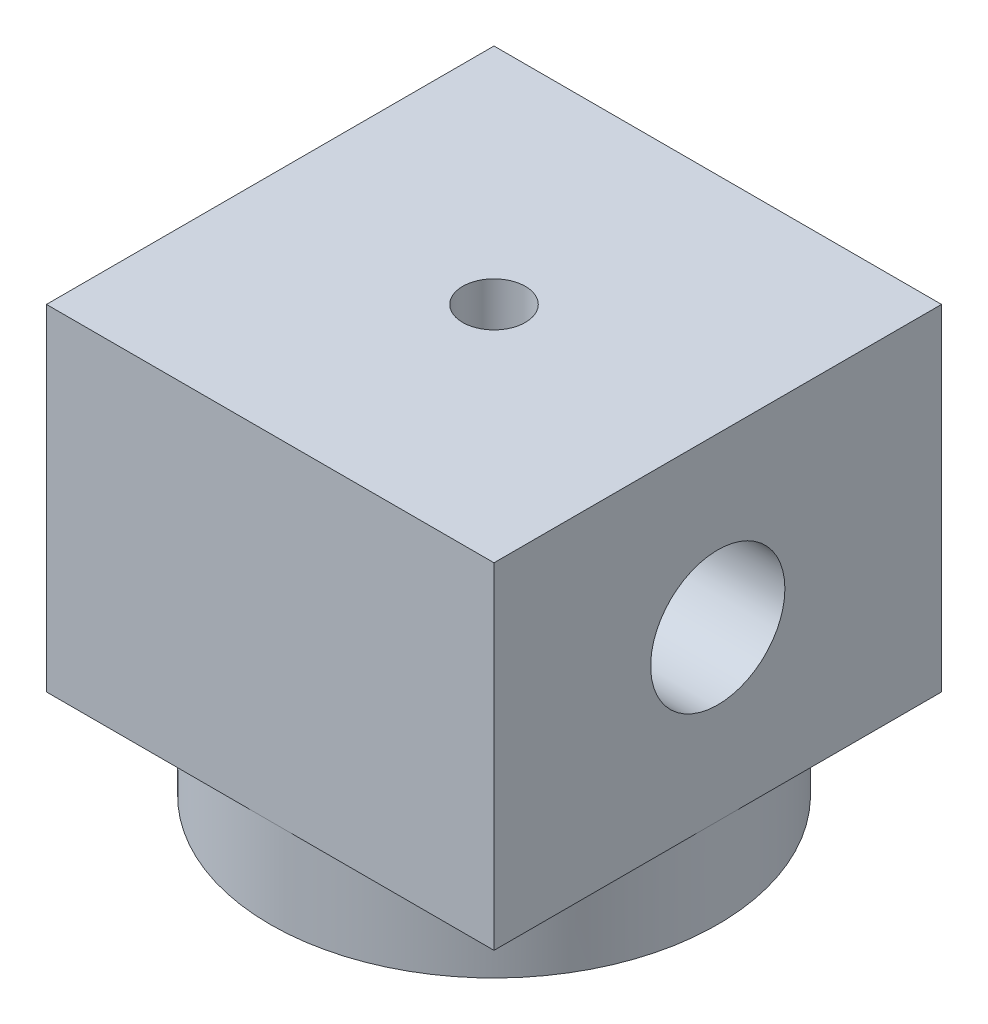
ISO-10303-21;
HEADER;
FILE_DESCRIPTION(('STEP AP214'),'2;1');
FILE_NAME('part.step','',(''),(''),'','','');
FILE_SCHEMA(('AUTOMOTIVE_DESIGN { 1 0 10303 214 1 1 1 1 }'));
ENDSEC;
DATA;
#1=APPLICATION_CONTEXT('core data for automotive mechanical design processes');
#2=APPLICATION_PROTOCOL_DEFINITION('international standard','automotive_design',2000,#1);
#3=PRODUCT_CONTEXT('',#1,'mechanical');
#4=PRODUCT('Part','Part','',(#3));
#5=PRODUCT_RELATED_PRODUCT_CATEGORY('part','',(#4));
#6=PRODUCT_DEFINITION_FORMATION('','',#4);
#7=PRODUCT_DEFINITION_CONTEXT('part definition',#1,'design');
#8=PRODUCT_DEFINITION('design','',#6,#7);
#9=PRODUCT_DEFINITION_SHAPE('','',#8);
#10=(LENGTH_UNIT() NAMED_UNIT(*) SI_UNIT(.MILLI.,.METRE.));
#11=(NAMED_UNIT(*) PLANE_ANGLE_UNIT() SI_UNIT($,.RADIAN.));
#12=(NAMED_UNIT(*) SI_UNIT($,.STERADIAN.) SOLID_ANGLE_UNIT());
#13=UNCERTAINTY_MEASURE_WITH_UNIT(LENGTH_MEASURE(1.E-05),#10,'distance_accuracy_value','');
#14=(GEOMETRIC_REPRESENTATION_CONTEXT(3) GLOBAL_UNCERTAINTY_ASSIGNED_CONTEXT((#13)) GLOBAL_UNIT_ASSIGNED_CONTEXT((#10,
#11,#12)) REPRESENTATION_CONTEXT('',''));
#15=CARTESIAN_POINT('',(0.,0.,0.));
#16=DIRECTION('',(0.,0.,1.));
#17=DIRECTION('',(1.,0.,0.));
#18=AXIS2_PLACEMENT_3D('',#15,#16,#17);
#19=CARTESIAN_POINT('',(0.,4.,0.));
#20=DIRECTION('',(0.,-1.,0.));
#21=DIRECTION('',(0.,0.,-1.));
#22=AXIS2_PLACEMENT_3D('',#19,#20,#21);
#23=CYLINDRICAL_SURFACE('',#22,10.);
#24=CARTESIAN_POINT('',(0.,4.,0.));
#25=DIRECTION('',(0.,1.,0.));
#26=DIRECTION('',(0.,0.,1.));
#27=AXIS2_PLACEMENT_3D('',#24,#25,#26);
#28=CIRCLE('',#27,10.);
#29=CARTESIAN_POINT('',(0.,4.,10.));
#30=VERTEX_POINT('',#29);
#31=CARTESIAN_POINT('',(10.,4.,0.));
#32=VERTEX_POINT('',#31);
#33=EDGE_CURVE('E11',#30,#32,#28,.T.);
#34=ORIENTED_EDGE('',*,*,#33,.F.);
#35=CARTESIAN_POINT('',(-10.,4.,0.));
#36=VERTEX_POINT('',#35);
#37=EDGE_CURVE('E61',#36,#30,#28,.T.);
#38=ORIENTED_EDGE('',*,*,#37,.F.);
#39=CARTESIAN_POINT('',(0.,4.,-10.));
#40=VERTEX_POINT('',#39);
#41=EDGE_CURVE('E71',#40,#36,#28,.T.);
#42=ORIENTED_EDGE('',*,*,#41,.F.);
#43=EDGE_CURVE('E59',#32,#40,#28,.T.);
#44=ORIENTED_EDGE('',*,*,#43,.F.);
#45=EDGE_LOOP('',(#34,#38,#42,#44));
#46=FACE_BOUND('',#45,.T.);
#47=CARTESIAN_POINT('',(0.,0.,0.));
#48=DIRECTION('',(0.,1.,0.));
#49=DIRECTION('',(0.,0.,1.));
#50=AXIS2_PLACEMENT_3D('',#47,#48,#49);
#51=CIRCLE('',#50,10.);
#52=CARTESIAN_POINT('',(0.,0.,10.));
#53=VERTEX_POINT('',#52);
#54=EDGE_CURVE('E144',#53,#53,#51,.T.);
#55=ORIENTED_EDGE('',*,*,#54,.T.);
#56=EDGE_LOOP('',(#55));
#57=FACE_BOUND('',#56,.T.);
#58=ADVANCED_FACE('F45',(#46,#57),#23,.T.);
#59=CARTESIAN_POINT('',(0.,0.,0.));
#60=DIRECTION('',(0.,1.,0.));
#61=DIRECTION('',(0.,0.,1.));
#62=AXIS2_PLACEMENT_3D('',#59,#60,#61);
#63=PLANE('',#62);
#64=CARTESIAN_POINT('',(0.,0.,0.));
#65=DIRECTION('',(0.,-1.,0.));
#66=DIRECTION('',(0.,0.,-1.));
#67=AXIS2_PLACEMENT_3D('',#64,#65,#66);
#68=CIRCLE('',#67,2.45);
#69=CARTESIAN_POINT('',(0.,0.,-2.45));
#70=VERTEX_POINT('',#69);
#71=EDGE_CURVE('E131',#70,#70,#68,.T.);
#72=ORIENTED_EDGE('',*,*,#71,.F.);
#73=EDGE_LOOP('',(#72));
#74=FACE_BOUND('',#73,.T.);
#75=ORIENTED_EDGE('',*,*,#54,.F.);
#76=EDGE_LOOP('',(#75));
#77=FACE_BOUND('',#76,.T.);
#78=ADVANCED_FACE('F237',(#74,#77),#63,.F.);
#79=CARTESIAN_POINT('',(0.,2.5,0.));
#80=DIRECTION('',(0.,-1.,0.));
#81=DIRECTION('',(0.,0.,-1.));
#82=AXIS2_PLACEMENT_3D('',#79,#80,#81);
#83=CYLINDRICAL_SURFACE('',#82,2.45);
#84=CARTESIAN_POINT('',(0.,2.5,0.));
#85=DIRECTION('',(0.,-1.,0.));
#86=DIRECTION('',(0.,0.,-1.));
#87=AXIS2_PLACEMENT_3D('',#84,#85,#86);
#88=CIRCLE('',#87,2.45);
#89=CARTESIAN_POINT('',(0.,2.5,-2.45));
#90=VERTEX_POINT('',#89);
#91=EDGE_CURVE('E136',#90,#90,#88,.T.);
#92=ORIENTED_EDGE('',*,*,#91,.F.);
#93=EDGE_LOOP('',(#92));
#94=FACE_BOUND('',#93,.T.);
#95=ORIENTED_EDGE('',*,*,#71,.T.);
#96=EDGE_LOOP('',(#95));
#97=FACE_BOUND('',#96,.T.);
#98=ADVANCED_FACE('F242',(#94,#97),#83,.F.);
#99=CARTESIAN_POINT('',(0.,2.5,0.));
#100=DIRECTION('',(0.,-1.,0.));
#101=DIRECTION('',(0.,0.,-1.));
#102=AXIS2_PLACEMENT_3D('',#99,#100,#101);
#103=PLANE('',#102);
#104=ORIENTED_EDGE('',*,*,#91,.T.);
#105=EDGE_LOOP('',(#104));
#106=FACE_BOUND('',#105,.T.);
#107=ADVANCED_FACE('F235',(#106),#103,.T.);
#108=CARTESIAN_POINT('',(10.,4.,10.));
#109=DIRECTION('',(0.,1.,0.));
#110=DIRECTION('',(0.,0.,1.));
#111=AXIS2_PLACEMENT_3D('',#108,#109,#110);
#112=PLANE('',#111);
#113=DIRECTION('',(-1.,0.,0.));
#114=VECTOR('',#113,1.);
#115=CARTESIAN_POINT('',(10.,4.,10.));
#116=LINE('',#115,#114);
#117=CARTESIAN_POINT('',(10.,4.,10.));
#118=VERTEX_POINT('',#117);
#119=EDGE_CURVE('E107',#118,#30,#116,.T.);
#120=ORIENTED_EDGE('',*,*,#119,.T.);
#121=ORIENTED_EDGE('',*,*,#33,.T.);
#122=DIRECTION('',(0.,0.,-1.));
#123=VECTOR('',#122,1.);
#124=CARTESIAN_POINT('',(10.,4.,10.));
#125=LINE('',#124,#123);
#126=EDGE_CURVE('E103',#118,#32,#125,.T.);
#127=ORIENTED_EDGE('',*,*,#126,.F.);
#128=EDGE_LOOP('',(#120,#121,#127));
#129=FACE_BOUND('',#128,.T.);
#130=ADVANCED_FACE('F105',(#129),#112,.F.);
#131=CARTESIAN_POINT('',(10.,4.,-10.));
#132=VERTEX_POINT('',#131);
#133=EDGE_CURVE('E112',#32,#132,#125,.T.);
#134=ORIENTED_EDGE('',*,*,#133,.F.);
#135=ORIENTED_EDGE('',*,*,#43,.T.);
#136=DIRECTION('',(-1.,0.,0.));
#137=VECTOR('',#136,1.);
#138=CARTESIAN_POINT('',(10.,4.,-10.));
#139=LINE('',#138,#137);
#140=EDGE_CURVE('E138',#132,#40,#139,.T.);
#141=ORIENTED_EDGE('',*,*,#140,.F.);
#142=EDGE_LOOP('',(#134,#135,#141));
#143=FACE_BOUND('',#142,.T.);
#144=ADVANCED_FACE('F160',(#143),#112,.F.);
#145=CARTESIAN_POINT('',(-10.,4.,-10.));
#146=VERTEX_POINT('',#145);
#147=EDGE_CURVE('E163',#40,#146,#139,.T.);
#148=ORIENTED_EDGE('',*,*,#147,.F.);
#149=ORIENTED_EDGE('',*,*,#41,.T.);
#150=DIRECTION('',(0.,0.,-1.));
#151=VECTOR('',#150,1.);
#152=CARTESIAN_POINT('',(-10.,4.,10.));
#153=LINE('',#152,#151);
#154=EDGE_CURVE('E165',#36,#146,#153,.T.);
#155=ORIENTED_EDGE('',*,*,#154,.T.);
#156=EDGE_LOOP('',(#148,#149,#155));
#157=FACE_BOUND('',#156,.T.);
#158=ADVANCED_FACE('F164',(#157),#112,.F.);
#159=CARTESIAN_POINT('',(-10.,4.,10.));
#160=VERTEX_POINT('',#159);
#161=EDGE_CURVE('E188',#160,#36,#153,.T.);
#162=ORIENTED_EDGE('',*,*,#161,.T.);
#163=ORIENTED_EDGE('',*,*,#37,.T.);
#164=EDGE_CURVE('E129',#30,#160,#116,.T.);
#165=ORIENTED_EDGE('',*,*,#164,.T.);
#166=EDGE_LOOP('',(#162,#163,#165));
#167=FACE_BOUND('',#166,.T.);
#168=ADVANCED_FACE('F224',(#167),#112,.F.);
#169=CARTESIAN_POINT('',(10.,0.,0.));
#170=DIRECTION('',(-1.,0.,0.));
#171=DIRECTION('',(0.,0.,1.));
#172=AXIS2_PLACEMENT_3D('',#169,#170,#171);
#173=PLANE('',#172);
#174=DIRECTION('',(0.,-1.,0.));
#175=VECTOR('',#174,1.);
#176=CARTESIAN_POINT('',(10.,4.,10.));
#177=LINE('',#176,#175);
#178=CARTESIAN_POINT('',(10.,19.,10.));
#179=VERTEX_POINT('',#178);
#180=EDGE_CURVE('E115',#179,#118,#177,.T.);
#181=ORIENTED_EDGE('',*,*,#180,.T.);
#182=ORIENTED_EDGE('',*,*,#126,.T.);
#183=ORIENTED_EDGE('',*,*,#133,.T.);
#184=DIRECTION('',(0.,1.,0.));
#185=VECTOR('',#184,1.);
#186=CARTESIAN_POINT('',(10.,4.,-10.));
#187=LINE('',#186,#185);
#188=CARTESIAN_POINT('',(10.,19.,-10.));
#189=VERTEX_POINT('',#188);
#190=EDGE_CURVE('E111',#132,#189,#187,.T.);
#191=ORIENTED_EDGE('',*,*,#190,.T.);
#192=DIRECTION('',(0.,0.,1.));
#193=VECTOR('',#192,1.);
#194=CARTESIAN_POINT('',(10.,19.,10.));
#195=LINE('',#194,#193);
#196=EDGE_CURVE('E119',#189,#179,#195,.T.);
#197=ORIENTED_EDGE('',*,*,#196,.T.);
#198=EDGE_LOOP('',(#181,#182,#183,#191,#197));
#199=FACE_BOUND('',#198,.T.);
#200=CARTESIAN_POINT('',(10.,11.5,0.));
#201=DIRECTION('',(1.,0.,0.));
#202=DIRECTION('',(0.,0.,-1.));
#203=AXIS2_PLACEMENT_3D('',#200,#201,#202);
#204=CIRCLE('',#203,3.);
#205=CARTESIAN_POINT('',(10.,11.5,-3.));
#206=VERTEX_POINT('',#205);
#207=EDGE_CURVE('E195',#206,#206,#204,.T.);
#208=ORIENTED_EDGE('',*,*,#207,.F.);
#209=EDGE_LOOP('',(#208));
#210=FACE_BOUND('',#209,.T.);
#211=ADVANCED_FACE('F116',(#199,#210),#173,.F.);
#212=CARTESIAN_POINT('',(-10.,0.,0.));
#213=DIRECTION('',(-1.,0.,0.));
#214=DIRECTION('',(0.,0.,1.));
#215=AXIS2_PLACEMENT_3D('',#212,#213,#214);
#216=PLANE('',#215);
#217=DIRECTION('',(0.,-1.,0.));
#218=VECTOR('',#217,1.);
#219=CARTESIAN_POINT('',(-10.,4.,10.));
#220=LINE('',#219,#218);
#221=CARTESIAN_POINT('',(-10.,19.,10.));
#222=VERTEX_POINT('',#221);
#223=EDGE_CURVE('E193',#222,#160,#220,.T.);
#224=ORIENTED_EDGE('',*,*,#223,.F.);
#225=DIRECTION('',(0.,0.,1.));
#226=VECTOR('',#225,1.);
#227=CARTESIAN_POINT('',(-10.,19.,10.));
#228=LINE('',#227,#226);
#229=CARTESIAN_POINT('',(-10.,19.,-10.));
#230=VERTEX_POINT('',#229);
#231=EDGE_CURVE('E124',#230,#222,#228,.T.);
#232=ORIENTED_EDGE('',*,*,#231,.F.);
#233=DIRECTION('',(0.,1.,0.));
#234=VECTOR('',#233,1.);
#235=CARTESIAN_POINT('',(-10.,4.,-10.));
#236=LINE('',#235,#234);
#237=EDGE_CURVE('E185',#146,#230,#236,.T.);
#238=ORIENTED_EDGE('',*,*,#237,.F.);
#239=ORIENTED_EDGE('',*,*,#154,.F.);
#240=ORIENTED_EDGE('',*,*,#161,.F.);
#241=EDGE_LOOP('',(#224,#232,#238,#239,#240));
#242=FACE_BOUND('',#241,.T.);
#243=CARTESIAN_POINT('',(-10.,11.5,0.));
#244=DIRECTION('',(1.,0.,0.));
#245=DIRECTION('',(0.,0.,-1.));
#246=AXIS2_PLACEMENT_3D('',#243,#244,#245);
#247=CIRCLE('',#246,3.);
#248=CARTESIAN_POINT('',(-10.,11.5,-3.));
#249=VERTEX_POINT('',#248);
#250=EDGE_CURVE('E199',#249,#249,#247,.T.);
#251=ORIENTED_EDGE('',*,*,#250,.T.);
#252=EDGE_LOOP('',(#251));
#253=FACE_BOUND('',#252,.T.);
#254=ADVANCED_FACE('F222',(#242,#253),#216,.T.);
#255=CARTESIAN_POINT('',(10.,4.,10.));
#256=DIRECTION('',(0.,0.,-1.));
#257=DIRECTION('',(-1.,0.,0.));
#258=AXIS2_PLACEMENT_3D('',#255,#256,#257);
#259=PLANE('',#258);
#260=ORIENTED_EDGE('',*,*,#223,.T.);
#261=ORIENTED_EDGE('',*,*,#164,.F.);
#262=ORIENTED_EDGE('',*,*,#119,.F.);
#263=ORIENTED_EDGE('',*,*,#180,.F.);
#264=DIRECTION('',(-1.,0.,0.));
#265=VECTOR('',#264,1.);
#266=CARTESIAN_POINT('',(10.,19.,10.));
#267=LINE('',#266,#265);
#268=EDGE_CURVE('E176',#179,#222,#267,.T.);
#269=ORIENTED_EDGE('',*,*,#268,.T.);
#270=EDGE_LOOP('',(#260,#261,#262,#263,#269));
#271=FACE_BOUND('',#270,.T.);
#272=ADVANCED_FACE('F128',(#271),#259,.F.);
#273=CARTESIAN_POINT('',(10.,4.,-10.));
#274=DIRECTION('',(0.,0.,1.));
#275=DIRECTION('',(1.,0.,0.));
#276=AXIS2_PLACEMENT_3D('',#273,#274,#275);
#277=PLANE('',#276);
#278=ORIENTED_EDGE('',*,*,#237,.T.);
#279=DIRECTION('',(-1.,0.,0.));
#280=VECTOR('',#279,1.);
#281=CARTESIAN_POINT('',(10.,19.,-10.));
#282=LINE('',#281,#280);
#283=EDGE_CURVE('E169',#189,#230,#282,.T.);
#284=ORIENTED_EDGE('',*,*,#283,.F.);
#285=ORIENTED_EDGE('',*,*,#190,.F.);
#286=ORIENTED_EDGE('',*,*,#140,.T.);
#287=ORIENTED_EDGE('',*,*,#147,.T.);
#288=EDGE_LOOP('',(#278,#284,#285,#286,#287));
#289=FACE_BOUND('',#288,.T.);
#290=ADVANCED_FACE('F170',(#289),#277,.F.);
#291=CARTESIAN_POINT('',(10.,19.,10.));
#292=DIRECTION('',(0.,-1.,0.));
#293=DIRECTION('',(0.,0.,-1.));
#294=AXIS2_PLACEMENT_3D('',#291,#292,#293);
#295=PLANE('',#294);
#296=CARTESIAN_POINT('',(0.,19.,0.));
#297=DIRECTION('',(0.,1.,0.));
#298=DIRECTION('',(0.,0.,1.));
#299=AXIS2_PLACEMENT_3D('',#296,#297,#298);
#300=CIRCLE('',#299,1.4);
#301=CARTESIAN_POINT('',(0.,19.,1.4));
#302=VERTEX_POINT('',#301);
#303=EDGE_CURVE('E206',#302,#302,#300,.T.);
#304=ORIENTED_EDGE('',*,*,#303,.F.);
#305=EDGE_LOOP('',(#304));
#306=FACE_BOUND('',#305,.T.);
#307=ORIENTED_EDGE('',*,*,#231,.T.);
#308=ORIENTED_EDGE('',*,*,#268,.F.);
#309=ORIENTED_EDGE('',*,*,#196,.F.);
#310=ORIENTED_EDGE('',*,*,#283,.T.);
#311=EDGE_LOOP('',(#307,#308,#309,#310));
#312=FACE_BOUND('',#311,.T.);
#313=ADVANCED_FACE('F213',(#306,#312),#295,.F.);
#314=CARTESIAN_POINT('',(10.,11.5,0.));
#315=DIRECTION('',(-1.,0.,0.));
#316=DIRECTION('',(0.,0.,1.));
#317=AXIS2_PLACEMENT_3D('',#314,#315,#316);
#318=CYLINDRICAL_SURFACE('',#317,3.);
#319=CARTESIAN_POINT('',(0.,14.1532998322843,1.4));
#320=CARTESIAN_POINT('',(-0.0736787229793373,14.1533047888932,1.39999571352814));
#321=CARTESIAN_POINT('',(-0.147466840694243,14.1564141888297,1.39414590483531));
#322=CARTESIAN_POINT('',(-0.292836144871585,14.1684206981347,1.37101835448643));
#323=CARTESIAN_POINT('',(-0.364411674487385,14.1773315339092,1.35371350816908));
#324=CARTESIAN_POINT('',(-0.502985900342087,14.1996916673052,1.30854522610369));
#325=CARTESIAN_POINT('',(-0.570004716042375,14.2131192127953,1.28073231875779));
#326=CARTESIAN_POINT('',(-0.6984087491208,14.2429666307421,1.21549028368259));
#327=CARTESIAN_POINT('',(-0.759794321202755,14.2593863146007,1.17806176197641));
#328=CARTESIAN_POINT('',(-0.880041125906701,14.2948052720923,1.09151212277982));
#329=CARTESIAN_POINT('',(-0.938409616288392,14.3139050124312,1.0417472087445));
#330=CARTESIAN_POINT('',(-1.04634737075833,14.3517158974943,0.933281830218116));
#331=CARTESIAN_POINT('',(-1.09591269973929,14.3704268651497,0.874577391332976));
#332=CARTESIAN_POINT('',(-1.18758486548194,14.4066273529443,0.745810658698222));
#333=CARTESIAN_POINT('',(-1.22910716433243,14.4239868766522,0.675292280644753));
#334=CARTESIAN_POINT('',(-1.29947845243591,14.4542565026684,0.527311057851376));
#335=CARTESIAN_POINT('',(-1.32833443309336,14.4671690587112,0.449852072609914));
#336=CARTESIAN_POINT('',(-1.37067308697083,14.4863710650128,0.295390079119278));
#337=CARTESIAN_POINT('',(-1.38501373528607,14.4930282176436,0.218668950271234));
#338=CARTESIAN_POINT('',(-1.40071792428044,14.5003265093029,0.0636413910695604));
#339=CARTESIAN_POINT('',(-1.40208818717171,14.5009707646565,-0.0146641970085159));
#340=CARTESIAN_POINT('',(-1.39219412736691,14.4963630402075,-0.164278131042423));
#341=CARTESIAN_POINT('',(-1.38188203042654,14.4915554119441,-0.235666009099907));
#342=CARTESIAN_POINT('',(-1.35058969076275,14.477230202193,-0.375560866238984));
#343=CARTESIAN_POINT('',(-1.32960865576384,14.4677122709196,-0.444067630959941));
#344=CARTESIAN_POINT('',(-1.2773770553134,14.4446793288996,-0.577512868249009));
#345=CARTESIAN_POINT('',(-1.24597799043518,14.4311068202917,-0.642382881798667));
#346=CARTESIAN_POINT('',(-1.173975372053,14.4012318425181,-0.766100602995051));
#347=CARTESIAN_POINT('',(-1.13336844345246,14.3849283729061,-0.824946090873087));
#348=CARTESIAN_POINT('',(-1.04011458655119,14.3495302879083,-0.940275728917535));
#349=CARTESIAN_POINT('',(-0.986737398611854,14.3303162168047,-0.996133417288747));
#350=CARTESIAN_POINT('',(-0.871449995662849,14.2922152770553,-1.09841656129717));
#351=CARTESIAN_POINT('',(-0.809534701557759,14.2733286107589,-1.14483636160644));
#352=CARTESIAN_POINT('',(-0.675116261786902,14.2370415572506,-1.22915309402811));
#353=CARTESIAN_POINT('',(-0.602239763059041,14.2197617454197,-1.26651156157658));
#354=CARTESIAN_POINT('',(-0.450222124779384,14.190199066265,-1.3281606720683));
#355=CARTESIAN_POINT('',(-0.371086816623932,14.1779116115328,-1.35246331847477));
#356=CARTESIAN_POINT('',(-0.215069654032031,14.1609592760428,-1.38550290939879));
#357=CARTESIAN_POINT('',(-0.138461500518812,14.1557932810472,-1.3952675640713));
#358=CARTESIAN_POINT('',(0.0154564900143278,14.1522317960817,-1.40202930527327));
#359=CARTESIAN_POINT('',(0.092765938021635,14.1538327572276,-1.3990330841512));
#360=CARTESIAN_POINT('',(0.23858140092518,14.163097649841,-1.38130036721999));
#361=CARTESIAN_POINT('',(0.307257894267153,14.1702084536909,-1.36763411700017));
#362=CARTESIAN_POINT('',(0.441245907449926,14.1889200148623,-1.33046559580409));
#363=CARTESIAN_POINT('',(0.506556483957806,14.2005220232193,-1.30696058406924));
#364=CARTESIAN_POINT('',(0.635344525519614,14.2275466214734,-1.24961375514148));
#365=CARTESIAN_POINT('',(0.6985996437201,14.2431203473557,-1.21534636235873));
#366=CARTESIAN_POINT('',(0.818807668065258,14.276166286234,-1.13783766252748));
#367=CARTESIAN_POINT('',(0.875757439949789,14.2936394349184,-1.09459192295911));
#368=CARTESIAN_POINT('',(0.988089579952792,14.3307624239435,-0.994937151983087));
#369=CARTESIAN_POINT('',(1.04265498451554,14.3504454340572,-0.937615557418592));
#370=CARTESIAN_POINT('',(1.14160320533367,14.3881069827271,-0.814245213308087));
#371=CARTESIAN_POINT('',(1.18598388463898,14.406085163114,-0.748194636827835));
#372=CARTESIAN_POINT('',(1.26377366163905,14.4386827283039,-0.607788098935525));
#373=CARTESIAN_POINT('',(1.29701225157627,14.4532489693911,-0.533324510362889));
#374=CARTESIAN_POINT('',(1.35018973612547,14.4769852902628,-0.378992131421512));
#375=CARTESIAN_POINT('',(1.37013876871171,14.4861594827556,-0.299127512594864));
#376=CARTESIAN_POINT('',(1.39466906090605,14.4974983401294,-0.143460535211263));
#377=CARTESIAN_POINT('',(1.40039427646173,14.5001842614184,-0.0678756880709877));
#378=CARTESIAN_POINT('',(1.39956378011464,14.49979616517,0.0832016027035665));
#379=CARTESIAN_POINT('',(1.39301133600945,14.4967236802787,0.15869406557537));
#380=CARTESIAN_POINT('',(1.36861249901134,14.4854636639732,0.303311036433137));
#381=CARTESIAN_POINT('',(1.35137572965134,14.4775525197806,0.372561963064841));
#382=CARTESIAN_POINT('',(1.30685141722692,14.4576114682609,0.507113225009694));
#383=CARTESIAN_POINT('',(1.2795622404927,14.4455808914856,0.572412916177327));
#384=CARTESIAN_POINT('',(1.21436916147478,14.4178389464733,0.700503609168539));
#385=CARTESIAN_POINT('',(1.17603996692188,14.4019853846086,0.763046505751655));
#386=CARTESIAN_POINT('',(1.09041682491712,14.3683548472164,0.881086583528212));
#387=CARTESIAN_POINT('',(1.0431188460055,14.3505770082765,0.936580577442688));
#388=CARTESIAN_POINT('',(0.936079401738269,14.3130974324196,1.04402904072737));
#389=CARTESIAN_POINT('',(0.875612036338808,14.2933632448711,1.09525139898434));
#390=CARTESIAN_POINT('',(0.746489487124849,14.2556198478298,1.18702523780947));
#391=CARTESIAN_POINT('',(0.677828553080512,14.2376118659578,1.22756915951301));
#392=CARTESIAN_POINT('',(0.53286557537044,14.2053450090732,1.29715278383447));
#393=CARTESIAN_POINT('',(0.456473231544601,14.1911397793725,1.32603053285722));
#394=CARTESIAN_POINT('',(0.299113348361741,14.1689824858497,1.37009431109119));
#395=CARTESIAN_POINT('',(0.218162153353703,14.1610094396025,1.38532630815561));
#396=CARTESIAN_POINT('',(0.113798139360814,14.1556408571884,1.39555466289762));
#397=CARTESIAN_POINT('',(0.0910829113240859,14.1547652413354,1.39721971242147));
#398=CARTESIAN_POINT('',(0.0455819483862019,14.1535939487508,1.39944306955698));
#399=CARTESIAN_POINT('',(0.0227962102885704,14.1532982987086,1.40000132623517));
#400=CARTESIAN_POINT('',(0.,14.1532998322843,1.4));
#401=B_SPLINE_CURVE_WITH_KNOTS('',3,(#319,#320,#321,#322,#323,#324,#325,#326,#327,#328,#329,
#330,#331,#332,#333,#334,#335,#336,#337,#338,#339,#340,#341,#342,#343,#344,#345,#346,#347,#348,
#349,#350,#351,#352,#353,#354,#355,#356,#357,#358,#359,#360,#361,#362,#363,#364,#365,#366,#367,
#368,#369,#370,#371,#372,#373,#374,#375,#376,#377,#378,#379,#380,#381,#382,#383,#384,#385,#386,
#387,#388,#389,#390,#391,#392,#393,#394,#395,#396,#397,#398,#399,#400),.UNSPECIFIED.,.T.,.F.,(4,
2,2,2,2,2,2,2,2,2,2,2,2,2,2,2,2,2,2,2,2,2,2,2,2,2,2,2,2,2,2,2,2,2,2,2,2,2,2,2,4),(0.,
0.220940352311492,0.442405366583107,0.662818738822948,0.88321822293882,1.11934570174827,
1.3555784678546,1.60524704367139,1.85477763655655,2.08850298904531,2.32210720114893,
2.53795914953509,2.75382712943144,2.97291470778532,3.19208272178506,3.4298904622895,
3.66784028358938,3.91762014002177,4.16716995524468,4.39806662249434,4.62884221258179,
4.83904816411134,5.04931271118522,5.26924477564245,5.48928567765634,5.73282666065089,
5.97641869657436,6.22358429788487,6.47056113168194,6.69691875374547,6.9232161374703,
7.13765876490748,7.35213625793409,7.57634130659147,7.80064737512631,8.04453832716884,
8.28860145927468,8.53594505754407,8.78245227248032,8.8508081120715,8.91916709725554),.UNSPECIFIED.);
#402=CARTESIAN_POINT('',(0.,14.1532998322843,1.4));
#403=VERTEX_POINT('',#402);
#404=EDGE_CURVE('E48',#403,#403,#401,.T.);
#405=ORIENTED_EDGE('',*,*,#404,.F.);
#406=EDGE_LOOP('',(#405));
#407=FACE_BOUND('',#406,.T.);
#408=ORIENTED_EDGE('',*,*,#207,.T.);
#409=EDGE_LOOP('',(#408));
#410=FACE_BOUND('',#409,.T.);
#411=ORIENTED_EDGE('',*,*,#250,.F.);
#412=EDGE_LOOP('',(#411));
#413=FACE_BOUND('',#412,.T.);
#414=ADVANCED_FACE('F216',(#407,#410,#413),#318,.F.);
#415=CARTESIAN_POINT('',(0.,11.,0.));
#416=DIRECTION('',(0.,1.,0.));
#417=DIRECTION('',(0.,0.,1.));
#418=AXIS2_PLACEMENT_3D('',#415,#416,#417);
#419=CYLINDRICAL_SURFACE('',#418,1.4);
#420=ORIENTED_EDGE('',*,*,#404,.T.);
#421=EDGE_LOOP('',(#420));
#422=FACE_BOUND('',#421,.T.);
#423=ORIENTED_EDGE('',*,*,#303,.T.);
#424=EDGE_LOOP('',(#423));
#425=FACE_BOUND('',#424,.T.);
#426=ADVANCED_FACE('F211',(#422,#425),#419,.F.);
#427=CLOSED_SHELL('',(#58,#78,#98,#107,#130,#144,#158,#168,#211,#254,#272,#290,#313,#414,#426));
#428=MANIFOLD_SOLID_BREP('B2',#427);
#429=ADVANCED_BREP_SHAPE_REPRESENTATION('',(#18,#428),#14);
#430=SHAPE_DEFINITION_REPRESENTATION(#9,#429);
ENDSEC;
END-ISO-10303-21;
